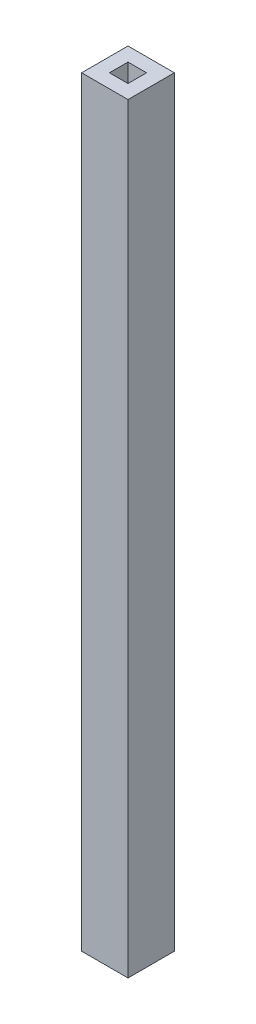
ISO-10303-21;
HEADER;
FILE_DESCRIPTION(('STEP AP214'),'2;1');
FILE_NAME('part.step','',(''),(''),'','','');
FILE_SCHEMA(('AUTOMOTIVE_DESIGN { 1 0 10303 214 1 1 1 1 }'));
ENDSEC;
DATA;
#1=APPLICATION_CONTEXT('core data for automotive mechanical design processes');
#2=APPLICATION_PROTOCOL_DEFINITION('international standard','automotive_design',2000,#1);
#3=PRODUCT_CONTEXT('',#1,'mechanical');
#4=PRODUCT('Part','Part','',(#3));
#5=PRODUCT_RELATED_PRODUCT_CATEGORY('part','',(#4));
#6=PRODUCT_DEFINITION_FORMATION('','',#4);
#7=PRODUCT_DEFINITION_CONTEXT('part definition',#1,'design');
#8=PRODUCT_DEFINITION('design','',#6,#7);
#9=PRODUCT_DEFINITION_SHAPE('','',#8);
#10=(LENGTH_UNIT() NAMED_UNIT(*) SI_UNIT(.MILLI.,.METRE.));
#11=(NAMED_UNIT(*) PLANE_ANGLE_UNIT() SI_UNIT($,.RADIAN.));
#12=(NAMED_UNIT(*) SI_UNIT($,.STERADIAN.) SOLID_ANGLE_UNIT());
#13=UNCERTAINTY_MEASURE_WITH_UNIT(LENGTH_MEASURE(1.E-05),#10,'distance_accuracy_value','');
#14=(GEOMETRIC_REPRESENTATION_CONTEXT(3) GLOBAL_UNCERTAINTY_ASSIGNED_CONTEXT((#13)) GLOBAL_UNIT_ASSIGNED_CONTEXT((#10,
#11,#12)) REPRESENTATION_CONTEXT('',''));
#15=CARTESIAN_POINT('',(0.,0.,0.));
#16=DIRECTION('',(0.,0.,1.));
#17=DIRECTION('',(1.,0.,0.));
#18=AXIS2_PLACEMENT_3D('',#15,#16,#17);
#19=CARTESIAN_POINT('',(0.,82.,-1.));
#20=DIRECTION('',(0.,0.,-1.));
#21=DIRECTION('',(-1.,0.,0.));
#22=AXIS2_PLACEMENT_3D('',#19,#20,#21);
#23=PLANE('',#22);
#24=DIRECTION('',(1.,0.,0.));
#25=VECTOR('',#24,1.);
#26=CARTESIAN_POINT('',(0.,0.,-1.));
#27=LINE('',#26,#25);
#28=CARTESIAN_POINT('',(-1.,0.,-1.));
#29=VERTEX_POINT('',#28);
#30=CARTESIAN_POINT('',(1.,0.,-1.));
#31=VERTEX_POINT('',#30);
#32=EDGE_CURVE('E161',#29,#31,#27,.T.);
#33=ORIENTED_EDGE('',*,*,#32,.T.);
#34=DIRECTION('',(0.,-1.,0.));
#35=VECTOR('',#34,1.);
#36=CARTESIAN_POINT('',(1.,82.,-1.));
#37=LINE('',#36,#35);
#38=CARTESIAN_POINT('',(1.,82.,-1.));
#39=VERTEX_POINT('',#38);
#40=EDGE_CURVE('E11',#39,#31,#37,.T.);
#41=ORIENTED_EDGE('',*,*,#40,.F.);
#42=DIRECTION('',(1.,0.,0.));
#43=VECTOR('',#42,1.);
#44=CARTESIAN_POINT('',(0.,82.,-1.));
#45=LINE('',#44,#43);
#46=CARTESIAN_POINT('',(-1.,82.,-1.));
#47=VERTEX_POINT('',#46);
#48=EDGE_CURVE('E125',#47,#39,#45,.T.);
#49=ORIENTED_EDGE('',*,*,#48,.F.);
#50=DIRECTION('',(0.,-1.,0.));
#51=VECTOR('',#50,1.);
#52=CARTESIAN_POINT('',(-1.,82.,-1.));
#53=LINE('',#52,#51);
#54=EDGE_CURVE('E65',#47,#29,#53,.T.);
#55=ORIENTED_EDGE('',*,*,#54,.T.);
#56=EDGE_LOOP('',(#33,#41,#49,#55));
#57=FACE_BOUND('',#56,.T.);
#58=ADVANCED_FACE('F45',(#57),#23,.F.);
#59=CARTESIAN_POINT('',(1.,82.,0.));
#60=DIRECTION('',(1.,0.,0.));
#61=DIRECTION('',(0.,0.,-1.));
#62=AXIS2_PLACEMENT_3D('',#59,#60,#61);
#63=PLANE('',#62);
#64=DIRECTION('',(0.,0.,1.));
#65=VECTOR('',#64,1.);
#66=CARTESIAN_POINT('',(1.,0.,0.));
#67=LINE('',#66,#65);
#68=CARTESIAN_POINT('',(1.,0.,1.));
#69=VERTEX_POINT('',#68);
#70=EDGE_CURVE('E132',#31,#69,#67,.T.);
#71=ORIENTED_EDGE('',*,*,#70,.T.);
#72=DIRECTION('',(0.,-1.,0.));
#73=VECTOR('',#72,1.);
#74=CARTESIAN_POINT('',(1.,82.,1.));
#75=LINE('',#74,#73);
#76=CARTESIAN_POINT('',(1.,82.,1.));
#77=VERTEX_POINT('',#76);
#78=EDGE_CURVE('E56',#77,#69,#75,.T.);
#79=ORIENTED_EDGE('',*,*,#78,.F.);
#80=DIRECTION('',(0.,0.,1.));
#81=VECTOR('',#80,1.);
#82=CARTESIAN_POINT('',(1.,82.,0.));
#83=LINE('',#82,#81);
#84=EDGE_CURVE('E119',#39,#77,#83,.T.);
#85=ORIENTED_EDGE('',*,*,#84,.F.);
#86=ORIENTED_EDGE('',*,*,#40,.T.);
#87=EDGE_LOOP('',(#71,#79,#85,#86));
#88=FACE_BOUND('',#87,.T.);
#89=ADVANCED_FACE('F131',(#88),#63,.F.);
#90=CARTESIAN_POINT('',(0.,82.,1.));
#91=DIRECTION('',(0.,0.,-1.));
#92=DIRECTION('',(-1.,0.,0.));
#93=AXIS2_PLACEMENT_3D('',#90,#91,#92);
#94=PLANE('',#93);
#95=DIRECTION('',(1.,0.,0.));
#96=VECTOR('',#95,1.);
#97=CARTESIAN_POINT('',(0.,0.,1.));
#98=LINE('',#97,#96);
#99=CARTESIAN_POINT('',(-1.,0.,1.));
#100=VERTEX_POINT('',#99);
#101=EDGE_CURVE('E166',#100,#69,#98,.T.);
#102=ORIENTED_EDGE('',*,*,#101,.F.);
#103=DIRECTION('',(0.,-1.,0.));
#104=VECTOR('',#103,1.);
#105=CARTESIAN_POINT('',(-1.,82.,1.));
#106=LINE('',#105,#104);
#107=CARTESIAN_POINT('',(-1.,82.,1.));
#108=VERTEX_POINT('',#107);
#109=EDGE_CURVE('E91',#108,#100,#106,.T.);
#110=ORIENTED_EDGE('',*,*,#109,.F.);
#111=DIRECTION('',(1.,0.,0.));
#112=VECTOR('',#111,1.);
#113=CARTESIAN_POINT('',(0.,82.,1.));
#114=LINE('',#113,#112);
#115=EDGE_CURVE('E124',#108,#77,#114,.T.);
#116=ORIENTED_EDGE('',*,*,#115,.T.);
#117=ORIENTED_EDGE('',*,*,#78,.T.);
#118=EDGE_LOOP('',(#102,#110,#116,#117));
#119=FACE_BOUND('',#118,.T.);
#120=ADVANCED_FACE('F137',(#119),#94,.T.);
#121=CARTESIAN_POINT('',(2.5,82.,0.));
#122=DIRECTION('',(1.,0.,0.));
#123=DIRECTION('',(0.,0.,-1.));
#124=AXIS2_PLACEMENT_3D('',#121,#122,#123);
#125=PLANE('',#124);
#126=DIRECTION('',(0.,0.,1.));
#127=VECTOR('',#126,1.);
#128=CARTESIAN_POINT('',(2.5,0.,0.));
#129=LINE('',#128,#127);
#130=CARTESIAN_POINT('',(2.5,0.,-2.5));
#131=VERTEX_POINT('',#130);
#132=CARTESIAN_POINT('',(2.5,0.,2.5));
#133=VERTEX_POINT('',#132);
#134=EDGE_CURVE('E146',#131,#133,#129,.T.);
#135=ORIENTED_EDGE('',*,*,#134,.F.);
#136=DIRECTION('',(0.,-1.,0.));
#137=VECTOR('',#136,1.);
#138=CARTESIAN_POINT('',(2.5,82.,-2.5));
#139=LINE('',#138,#137);
#140=CARTESIAN_POINT('',(2.5,82.,-2.5));
#141=VERTEX_POINT('',#140);
#142=EDGE_CURVE('E49',#141,#131,#139,.T.);
#143=ORIENTED_EDGE('',*,*,#142,.F.);
#144=DIRECTION('',(0.,0.,1.));
#145=VECTOR('',#144,1.);
#146=CARTESIAN_POINT('',(2.5,82.,0.));
#147=LINE('',#146,#145);
#148=CARTESIAN_POINT('',(2.5,82.,2.5));
#149=VERTEX_POINT('',#148);
#150=EDGE_CURVE('E173',#141,#149,#147,.T.);
#151=ORIENTED_EDGE('',*,*,#150,.T.);
#152=DIRECTION('',(0.,-1.,0.));
#153=VECTOR('',#152,1.);
#154=CARTESIAN_POINT('',(2.5,82.,2.5));
#155=LINE('',#154,#153);
#156=EDGE_CURVE('E142',#149,#133,#155,.T.);
#157=ORIENTED_EDGE('',*,*,#156,.T.);
#158=EDGE_LOOP('',(#135,#143,#151,#157));
#159=FACE_BOUND('',#158,.T.);
#160=ADVANCED_FACE('F47',(#159),#125,.T.);
#161=CARTESIAN_POINT('',(0.,82.,-2.5));
#162=DIRECTION('',(0.,0.,-1.));
#163=DIRECTION('',(-1.,0.,0.));
#164=AXIS2_PLACEMENT_3D('',#161,#162,#163);
#165=PLANE('',#164);
#166=DIRECTION('',(1.,0.,0.));
#167=VECTOR('',#166,1.);
#168=CARTESIAN_POINT('',(0.,0.,-2.5));
#169=LINE('',#168,#167);
#170=CARTESIAN_POINT('',(-2.5,0.,-2.5));
#171=VERTEX_POINT('',#170);
#172=EDGE_CURVE('E150',#171,#131,#169,.T.);
#173=ORIENTED_EDGE('',*,*,#172,.F.);
#174=DIRECTION('',(0.,-1.,0.));
#175=VECTOR('',#174,1.);
#176=CARTESIAN_POINT('',(-2.5,82.,-2.5));
#177=LINE('',#176,#175);
#178=CARTESIAN_POINT('',(-2.5,82.,-2.5));
#179=VERTEX_POINT('',#178);
#180=EDGE_CURVE('E183',#179,#171,#177,.T.);
#181=ORIENTED_EDGE('',*,*,#180,.F.);
#182=DIRECTION('',(1.,0.,0.));
#183=VECTOR('',#182,1.);
#184=CARTESIAN_POINT('',(0.,82.,-2.5));
#185=LINE('',#184,#183);
#186=EDGE_CURVE('E194',#179,#141,#185,.T.);
#187=ORIENTED_EDGE('',*,*,#186,.T.);
#188=ORIENTED_EDGE('',*,*,#142,.T.);
#189=EDGE_LOOP('',(#173,#181,#187,#188));
#190=FACE_BOUND('',#189,.T.);
#191=ADVANCED_FACE('F192',(#190),#165,.T.);
#192=CARTESIAN_POINT('',(-2.5,82.,0.));
#193=DIRECTION('',(1.,0.,0.));
#194=DIRECTION('',(0.,0.,-1.));
#195=AXIS2_PLACEMENT_3D('',#192,#193,#194);
#196=PLANE('',#195);
#197=DIRECTION('',(0.,0.,1.));
#198=VECTOR('',#197,1.);
#199=CARTESIAN_POINT('',(-2.5,0.,0.));
#200=LINE('',#199,#198);
#201=CARTESIAN_POINT('',(-2.5,0.,2.5));
#202=VERTEX_POINT('',#201);
#203=EDGE_CURVE('E154',#171,#202,#200,.T.);
#204=ORIENTED_EDGE('',*,*,#203,.T.);
#205=DIRECTION('',(0.,-1.,0.));
#206=VECTOR('',#205,1.);
#207=CARTESIAN_POINT('',(-2.5,82.,2.5));
#208=LINE('',#207,#206);
#209=CARTESIAN_POINT('',(-2.5,82.,2.5));
#210=VERTEX_POINT('',#209);
#211=EDGE_CURVE('E180',#210,#202,#208,.T.);
#212=ORIENTED_EDGE('',*,*,#211,.F.);
#213=DIRECTION('',(0.,0.,1.));
#214=VECTOR('',#213,1.);
#215=CARTESIAN_POINT('',(-2.5,82.,0.));
#216=LINE('',#215,#214);
#217=EDGE_CURVE('E208',#179,#210,#216,.T.);
#218=ORIENTED_EDGE('',*,*,#217,.F.);
#219=ORIENTED_EDGE('',*,*,#180,.T.);
#220=EDGE_LOOP('',(#204,#212,#218,#219));
#221=FACE_BOUND('',#220,.T.);
#222=ADVANCED_FACE('F201',(#221),#196,.F.);
#223=CARTESIAN_POINT('',(0.,82.,2.5));
#224=DIRECTION('',(0.,0.,-1.));
#225=DIRECTION('',(-1.,0.,0.));
#226=AXIS2_PLACEMENT_3D('',#223,#224,#225);
#227=PLANE('',#226);
#228=DIRECTION('',(1.,0.,0.));
#229=VECTOR('',#228,1.);
#230=CARTESIAN_POINT('',(0.,0.,2.5));
#231=LINE('',#230,#229);
#232=EDGE_CURVE('E157',#202,#133,#231,.T.);
#233=ORIENTED_EDGE('',*,*,#232,.T.);
#234=ORIENTED_EDGE('',*,*,#156,.F.);
#235=DIRECTION('',(1.,0.,0.));
#236=VECTOR('',#235,1.);
#237=CARTESIAN_POINT('',(0.,82.,2.5));
#238=LINE('',#237,#236);
#239=EDGE_CURVE('E205',#210,#149,#238,.T.);
#240=ORIENTED_EDGE('',*,*,#239,.F.);
#241=ORIENTED_EDGE('',*,*,#211,.T.);
#242=EDGE_LOOP('',(#233,#234,#240,#241));
#243=FACE_BOUND('',#242,.T.);
#244=ADVANCED_FACE('F204',(#243),#227,.F.);
#245=CARTESIAN_POINT('',(-1.,82.,0.));
#246=DIRECTION('',(1.,0.,0.));
#247=DIRECTION('',(0.,0.,-1.));
#248=AXIS2_PLACEMENT_3D('',#245,#246,#247);
#249=PLANE('',#248);
#250=DIRECTION('',(0.,0.,1.));
#251=VECTOR('',#250,1.);
#252=CARTESIAN_POINT('',(-1.,0.,0.));
#253=LINE('',#252,#251);
#254=EDGE_CURVE('E169',#29,#100,#253,.T.);
#255=ORIENTED_EDGE('',*,*,#254,.F.);
#256=ORIENTED_EDGE('',*,*,#54,.F.);
#257=DIRECTION('',(0.,0.,1.));
#258=VECTOR('',#257,1.);
#259=CARTESIAN_POINT('',(-1.,82.,0.));
#260=LINE('',#259,#258);
#261=EDGE_CURVE('E139',#47,#108,#260,.T.);
#262=ORIENTED_EDGE('',*,*,#261,.T.);
#263=ORIENTED_EDGE('',*,*,#109,.T.);
#264=EDGE_LOOP('',(#255,#256,#262,#263));
#265=FACE_BOUND('',#264,.T.);
#266=ADVANCED_FACE('F218',(#265),#249,.T.);
#267=CARTESIAN_POINT('',(0.,82.,0.));
#268=DIRECTION('',(0.,1.,0.));
#269=DIRECTION('',(0.,0.,1.));
#270=AXIS2_PLACEMENT_3D('',#267,#268,#269);
#271=PLANE('',#270);
#272=ORIENTED_EDGE('',*,*,#150,.F.);
#273=ORIENTED_EDGE('',*,*,#186,.F.);
#274=ORIENTED_EDGE('',*,*,#217,.T.);
#275=ORIENTED_EDGE('',*,*,#239,.T.);
#276=EDGE_LOOP('',(#272,#273,#274,#275));
#277=FACE_BOUND('',#276,.T.);
#278=ORIENTED_EDGE('',*,*,#48,.T.);
#279=ORIENTED_EDGE('',*,*,#84,.T.);
#280=ORIENTED_EDGE('',*,*,#115,.F.);
#281=ORIENTED_EDGE('',*,*,#261,.F.);
#282=EDGE_LOOP('',(#278,#279,#280,#281));
#283=FACE_BOUND('',#282,.T.);
#284=ADVANCED_FACE('F121',(#277,#283),#271,.T.);
#285=CARTESIAN_POINT('',(0.,0.,0.));
#286=DIRECTION('',(0.,1.,0.));
#287=DIRECTION('',(0.,0.,1.));
#288=AXIS2_PLACEMENT_3D('',#285,#286,#287);
#289=PLANE('',#288);
#290=ORIENTED_EDGE('',*,*,#134,.T.);
#291=ORIENTED_EDGE('',*,*,#232,.F.);
#292=ORIENTED_EDGE('',*,*,#203,.F.);
#293=ORIENTED_EDGE('',*,*,#172,.T.);
#294=EDGE_LOOP('',(#290,#291,#292,#293));
#295=FACE_BOUND('',#294,.T.);
#296=ORIENTED_EDGE('',*,*,#32,.F.);
#297=ORIENTED_EDGE('',*,*,#254,.T.);
#298=ORIENTED_EDGE('',*,*,#101,.T.);
#299=ORIENTED_EDGE('',*,*,#70,.F.);
#300=EDGE_LOOP('',(#296,#297,#298,#299));
#301=FACE_BOUND('',#300,.T.);
#302=ADVANCED_FACE('F198',(#295,#301),#289,.F.);
#303=CLOSED_SHELL('',(#58,#89,#120,#160,#191,#222,#244,#266,#284,#302));
#304=MANIFOLD_SOLID_BREP('B2',#303);
#305=ADVANCED_BREP_SHAPE_REPRESENTATION('',(#18,#304),#14);
#306=SHAPE_DEFINITION_REPRESENTATION(#9,#305);
ENDSEC;
END-ISO-10303-21;
